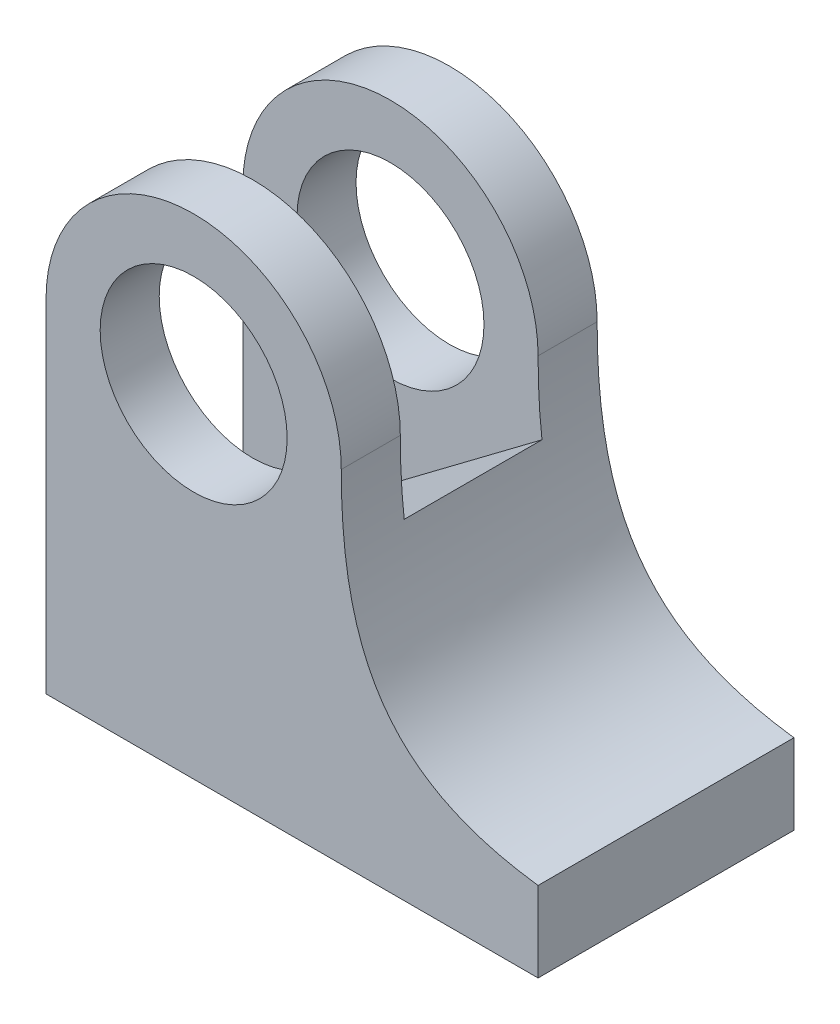
ISO-10303-21;
HEADER;
FILE_DESCRIPTION(('STEP AP214'),'2;1');
FILE_NAME('part.step','',(''),(''),'','','');
FILE_SCHEMA(('AUTOMOTIVE_DESIGN { 1 0 10303 214 1 1 1 1 }'));
ENDSEC;
DATA;
#1=APPLICATION_CONTEXT('core data for automotive mechanical design processes');
#2=APPLICATION_PROTOCOL_DEFINITION('international standard','automotive_design',2000,#1);
#3=PRODUCT_CONTEXT('',#1,'mechanical');
#4=PRODUCT('Part','Part','',(#3));
#5=PRODUCT_RELATED_PRODUCT_CATEGORY('part','',(#4));
#6=PRODUCT_DEFINITION_FORMATION('','',#4);
#7=PRODUCT_DEFINITION_CONTEXT('part definition',#1,'design');
#8=PRODUCT_DEFINITION('design','',#6,#7);
#9=PRODUCT_DEFINITION_SHAPE('','',#8);
#10=(LENGTH_UNIT() NAMED_UNIT(*) SI_UNIT(.MILLI.,.METRE.));
#11=(NAMED_UNIT(*) PLANE_ANGLE_UNIT() SI_UNIT($,.RADIAN.));
#12=(NAMED_UNIT(*) SI_UNIT($,.STERADIAN.) SOLID_ANGLE_UNIT());
#13=UNCERTAINTY_MEASURE_WITH_UNIT(LENGTH_MEASURE(1.E-05),#10,'distance_accuracy_value','');
#14=(GEOMETRIC_REPRESENTATION_CONTEXT(3) GLOBAL_UNCERTAINTY_ASSIGNED_CONTEXT((#13)) GLOBAL_UNIT_ASSIGNED_CONTEXT((#10,
#11,#12)) REPRESENTATION_CONTEXT('',''));
#15=CARTESIAN_POINT('',(0.,0.,0.));
#16=DIRECTION('',(0.,0.,1.));
#17=DIRECTION('',(1.,0.,0.));
#18=AXIS2_PLACEMENT_3D('',#15,#16,#17);
#19=CARTESIAN_POINT('',(0.,0.,26.));
#20=DIRECTION('',(0.,0.,-1.));
#21=DIRECTION('',(-1.,0.,0.));
#22=AXIS2_PLACEMENT_3D('',#19,#20,#21);
#23=CYLINDRICAL_SURFACE('',#22,15.);
#24=DIRECTION('',(0.,0.,-1.));
#25=VECTOR('',#24,1.);
#26=CARTESIAN_POINT('',(15.,0.,26.));
#27=LINE('',#26,#25);
#28=CARTESIAN_POINT('',(15.,0.,26.));
#29=VERTEX_POINT('',#28);
#30=CARTESIAN_POINT('',(15.,0.,20.0000000000003));
#31=VERTEX_POINT('',#30);
#32=EDGE_CURVE('E177',#29,#31,#27,.T.);
#33=ORIENTED_EDGE('',*,*,#32,.T.);
#34=CARTESIAN_POINT('',(0.,0.,20.));
#35=DIRECTION('',(0.,0.,1.));
#36=DIRECTION('',(1.,0.,0.));
#37=AXIS2_PLACEMENT_3D('',#34,#35,#36);
#38=CIRCLE('',#37,15.);
#39=CARTESIAN_POINT('',(-15.,0.,20.0000000000001));
#40=VERTEX_POINT('',#39);
#41=EDGE_CURVE('E180',#31,#40,#38,.T.);
#42=ORIENTED_EDGE('',*,*,#41,.T.);
#43=DIRECTION('',(0.,0.,-1.));
#44=VECTOR('',#43,1.);
#45=CARTESIAN_POINT('',(-15.,0.,26.));
#46=LINE('',#45,#44);
#47=CARTESIAN_POINT('',(-15.,0.,26.));
#48=VERTEX_POINT('',#47);
#49=EDGE_CURVE('E54',#48,#40,#46,.T.);
#50=ORIENTED_EDGE('',*,*,#49,.F.);
#51=CARTESIAN_POINT('',(0.,0.,26.));
#52=DIRECTION('',(0.,0.,1.));
#53=DIRECTION('',(1.,0.,0.));
#54=AXIS2_PLACEMENT_3D('',#51,#52,#53);
#55=CIRCLE('',#54,15.);
#56=EDGE_CURVE('E181',#29,#48,#55,.T.);
#57=ORIENTED_EDGE('',*,*,#56,.F.);
#58=EDGE_LOOP('',(#33,#42,#50,#57));
#59=FACE_BOUND('',#58,.T.);
#60=ADVANCED_FACE('F45',(#59),#23,.T.);
#61=CARTESIAN_POINT('',(0.,0.,26.));
#62=DIRECTION('',(0.,0.,-1.));
#63=DIRECTION('',(-1.,0.,0.));
#64=AXIS2_PLACEMENT_3D('',#61,#62,#63);
#65=CYLINDRICAL_SURFACE('',#64,9.5);
#66=CARTESIAN_POINT('',(0.,0.,20.));
#67=DIRECTION('',(0.,0.,1.));
#68=DIRECTION('',(1.,0.,0.));
#69=AXIS2_PLACEMENT_3D('',#66,#67,#68);
#70=CIRCLE('',#69,9.5);
#71=CARTESIAN_POINT('',(-9.5,0.,20.0000000000001));
#72=VERTEX_POINT('',#71);
#73=EDGE_CURVE('E205',#72,#72,#70,.T.);
#74=CARTESIAN_POINT('',(0.,0.,26.));
#75=DIRECTION('',(0.,0.,1.));
#76=DIRECTION('',(1.,0.,0.));
#77=AXIS2_PLACEMENT_3D('',#74,#75,#76);
#78=CIRCLE('',#77,9.5);
#79=CARTESIAN_POINT('',(-9.5,0.,26.));
#80=VERTEX_POINT('',#79);
#81=EDGE_CURVE('E241',#80,#80,#78,.T.);
#82=CARTESIAN_POINT('',(-9.5,0.,20.0000000000001));
#83=CARTESIAN_POINT('',(-9.5,0.,20.0625000000001));
#84=CARTESIAN_POINT('',(-9.5,0.,20.1250000000001));
#85=CARTESIAN_POINT('',(-9.5,0.,20.2500000000001));
#86=CARTESIAN_POINT('',(-9.5,0.,20.3125000000001));
#87=CARTESIAN_POINT('',(-9.5,0.,20.4375000000001));
#88=CARTESIAN_POINT('',(-9.5,0.,20.5000000000001));
#89=CARTESIAN_POINT('',(-9.5,0.,20.6250000000001));
#90=CARTESIAN_POINT('',(-9.5,0.,20.6875000000001));
#91=CARTESIAN_POINT('',(-9.5,0.,20.8125000000001));
#92=CARTESIAN_POINT('',(-9.5,0.,20.8750000000001));
#93=CARTESIAN_POINT('',(-9.5,0.,21.0000000000001));
#94=CARTESIAN_POINT('',(-9.5,0.,21.0625000000001));
#95=CARTESIAN_POINT('',(-9.5,0.,21.1875000000001));
#96=CARTESIAN_POINT('',(-9.5,0.,21.2500000000001));
#97=CARTESIAN_POINT('',(-9.5,0.,21.3750000000001));
#98=CARTESIAN_POINT('',(-9.5,0.,21.4375000000001));
#99=CARTESIAN_POINT('',(-9.5,0.,21.5625000000001));
#100=CARTESIAN_POINT('',(-9.5,0.,21.6250000000001));
#101=CARTESIAN_POINT('',(-9.5,0.,21.7500000000001));
#102=CARTESIAN_POINT('',(-9.5,0.,21.8125000000001));
#103=CARTESIAN_POINT('',(-9.5,0.,21.9375000000001));
#104=CARTESIAN_POINT('',(-9.5,0.,22.0000000000001));
#105=CARTESIAN_POINT('',(-9.5,0.,22.1250000000001));
#106=CARTESIAN_POINT('',(-9.5,0.,22.1875000000001));
#107=CARTESIAN_POINT('',(-9.5,0.,22.3125000000001));
#108=CARTESIAN_POINT('',(-9.5,0.,22.3750000000001));
#109=CARTESIAN_POINT('',(-9.5,0.,22.5000000000001));
#110=CARTESIAN_POINT('',(-9.5,0.,22.5625000000001));
#111=CARTESIAN_POINT('',(-9.5,0.,22.6875000000001));
#112=CARTESIAN_POINT('',(-9.5,0.,22.75));
#113=CARTESIAN_POINT('',(-9.5,0.,22.8750000000001));
#114=CARTESIAN_POINT('',(-9.5,0.,22.9375));
#115=CARTESIAN_POINT('',(-9.5,0.,23.0625));
#116=CARTESIAN_POINT('',(-9.5,0.,23.125));
#117=CARTESIAN_POINT('',(-9.5,0.,23.25));
#118=CARTESIAN_POINT('',(-9.5,0.,23.3125));
#119=CARTESIAN_POINT('',(-9.5,0.,23.4375));
#120=CARTESIAN_POINT('',(-9.5,0.,23.5));
#121=CARTESIAN_POINT('',(-9.5,0.,23.625));
#122=CARTESIAN_POINT('',(-9.5,0.,23.6875));
#123=CARTESIAN_POINT('',(-9.5,0.,23.8125));
#124=CARTESIAN_POINT('',(-9.5,0.,23.875));
#125=CARTESIAN_POINT('',(-9.5,0.,24.));
#126=CARTESIAN_POINT('',(-9.5,0.,24.0625));
#127=CARTESIAN_POINT('',(-9.5,0.,24.1875));
#128=CARTESIAN_POINT('',(-9.5,0.,24.25));
#129=CARTESIAN_POINT('',(-9.5,0.,24.375));
#130=CARTESIAN_POINT('',(-9.5,0.,24.4375));
#131=CARTESIAN_POINT('',(-9.5,0.,24.5625));
#132=CARTESIAN_POINT('',(-9.5,0.,24.625));
#133=CARTESIAN_POINT('',(-9.5,0.,24.75));
#134=CARTESIAN_POINT('',(-9.5,0.,24.8125));
#135=CARTESIAN_POINT('',(-9.5,0.,24.9375));
#136=CARTESIAN_POINT('',(-9.5,0.,25.));
#137=CARTESIAN_POINT('',(-9.5,0.,25.125));
#138=CARTESIAN_POINT('',(-9.5,0.,25.1875));
#139=CARTESIAN_POINT('',(-9.5,0.,25.3125));
#140=CARTESIAN_POINT('',(-9.5,0.,25.375));
#141=CARTESIAN_POINT('',(-9.5,0.,25.5));
#142=CARTESIAN_POINT('',(-9.5,0.,25.5625));
#143=CARTESIAN_POINT('',(-9.5,0.,25.6875));
#144=CARTESIAN_POINT('',(-9.5,0.,25.75));
#145=CARTESIAN_POINT('',(-9.5,0.,25.875));
#146=CARTESIAN_POINT('',(-9.5,0.,25.9375));
#147=CARTESIAN_POINT('',(-9.5,0.,26.));
#148=B_SPLINE_CURVE_WITH_KNOTS('',3,(#82,#83,#84,#85,#86,#87,#88,#89,#90,#91,#92,#93,#94,#95,
#96,#97,#98,#99,#100,#101,#102,#103,#104,#105,#106,#107,#108,#109,#110,#111,#112,#113,#114,#115,
#116,#117,#118,#119,#120,#121,#122,#123,#124,#125,#126,#127,#128,#129,#130,#131,#132,#133,#134,
#135,#136,#137,#138,#139,#140,#141,#142,#143,#144,#145,#146,#147),.UNSPECIFIED.,.F.,.F.,(4,2,2,
2,2,2,2,2,2,2,2,2,2,2,2,2,2,2,2,2,2,2,2,2,2,2,2,2,2,2,2,2,4),(0.,0.187499999999997,
0.374999999999993,0.56249999999999,0.74999999999999,0.937499999999983,1.12499999999998,
1.31249999999998,1.49999999999998,1.68749999999997,1.87499999999997,2.06249999999997,
2.24999999999996,2.43749999999996,2.62499999999996,2.81249999999995,2.99999999999995,
3.18749999999995,3.37499999999994,3.56249999999994,3.74999999999994,3.93749999999993,
4.12499999999993,4.31249999999993,4.49999999999992,4.68749999999992,4.87499999999992,
5.06249999999991,5.24999999999991,5.43749999999991,5.62499999999991,5.8124999999999,
5.9999999999999),.UNSPECIFIED.);
#149=EDGE_CURVE('BSEAM166',#72,#80,#148,.T.);
#150=ORIENTED_EDGE('',*,*,#73,.F.);
#151=ORIENTED_EDGE('',*,*,#81,.T.);
#152=ORIENTED_EDGE('',*,*,#149,.T.);
#153=ORIENTED_EDGE('',*,*,#149,.F.);
#154=EDGE_LOOP('',(#150,#152,#151,#153));
#155=FACE_BOUND('',#154,.T.);
#156=ADVANCED_FACE('F166',(#155),#65,.F.);
#157=CARTESIAN_POINT('',(0.,0.,26.));
#158=DIRECTION('',(0.,0.,1.));
#159=DIRECTION('',(1.,0.,0.));
#160=AXIS2_PLACEMENT_3D('',#157,#158,#159);
#161=PLANE('',#160);
#162=ORIENTED_EDGE('',*,*,#56,.T.);
#163=DIRECTION('',(0.,-1.,0.));
#164=VECTOR('',#163,1.);
#165=CARTESIAN_POINT('',(-15.,0.,26.));
#166=LINE('',#165,#164);
#167=CARTESIAN_POINT('',(-15.,-34.7537820322793,26.));
#168=VERTEX_POINT('',#167);
#169=EDGE_CURVE('E104',#48,#168,#166,.T.);
#170=ORIENTED_EDGE('',*,*,#169,.T.);
#171=DIRECTION('',(1.,0.,0.));
#172=VECTOR('',#171,1.);
#173=CARTESIAN_POINT('',(-15.,-34.7537820322793,26.));
#174=LINE('',#173,#172);
#175=CARTESIAN_POINT('',(35.,-34.7537820322793,26.));
#176=VERTEX_POINT('',#175);
#177=EDGE_CURVE('E110',#168,#176,#174,.T.);
#178=ORIENTED_EDGE('',*,*,#177,.T.);
#179=DIRECTION('',(0.,1.,0.));
#180=VECTOR('',#179,1.);
#181=CARTESIAN_POINT('',(35.,-34.7537820322793,26.));
#182=LINE('',#181,#180);
#183=CARTESIAN_POINT('',(35.,-26.607408272313,26.));
#184=VERTEX_POINT('',#183);
#185=EDGE_CURVE('E115',#176,#184,#182,.T.);
#186=ORIENTED_EDGE('',*,*,#185,.T.);
#187=CARTESIAN_POINT('',(35.,-26.607408272313,26.));
#188=CARTESIAN_POINT('',(19.6217819704293,-24.621800080863,26.));
#189=CARTESIAN_POINT('',(15.,-15.8296162884274,26.));
#190=CARTESIAN_POINT('',(15.,0.,26.));
#191=B_SPLINE_CURVE_WITH_KNOTS('',3,(#187,#188,#189,#190),.UNSPECIFIED.,.F.,.F.,(4,4),(0.,1.),.UNSPECIFIED.);
#192=EDGE_CURVE('E70',#184,#29,#191,.T.);
#193=ORIENTED_EDGE('',*,*,#192,.T.);
#194=EDGE_LOOP('',(#162,#170,#178,#186,#193));
#195=FACE_BOUND('',#194,.T.);
#196=ORIENTED_EDGE('',*,*,#81,.F.);
#197=EDGE_LOOP('',(#196));
#198=FACE_BOUND('',#197,.T.);
#199=ADVANCED_FACE('F112',(#195,#198),#161,.T.);
#200=CARTESIAN_POINT('',(0.,0.,0.));
#201=DIRECTION('',(0.,0.,1.));
#202=DIRECTION('',(1.,0.,0.));
#203=AXIS2_PLACEMENT_3D('',#200,#201,#202);
#204=PLANE('',#203);
#205=CARTESIAN_POINT('',(0.,0.,0.));
#206=DIRECTION('',(0.,0.,1.));
#207=DIRECTION('',(1.,0.,0.));
#208=AXIS2_PLACEMENT_3D('',#205,#206,#207);
#209=CIRCLE('',#208,15.);
#210=CARTESIAN_POINT('',(15.,0.,0.));
#211=VERTEX_POINT('',#210);
#212=CARTESIAN_POINT('',(-15.,0.,0.));
#213=VERTEX_POINT('',#212);
#214=EDGE_CURVE('E143',#211,#213,#209,.T.);
#215=ORIENTED_EDGE('',*,*,#214,.F.);
#216=CARTESIAN_POINT('',(35.,-26.607408272313,0.));
#217=CARTESIAN_POINT('',(19.6217819704293,-24.621800080863,0.));
#218=CARTESIAN_POINT('',(15.,-15.8296162884274,0.));
#219=CARTESIAN_POINT('',(15.,0.,0.));
#220=B_SPLINE_CURVE_WITH_KNOTS('',3,(#216,#217,#218,#219),.UNSPECIFIED.,.F.,.F.,(4,4),(0.,1.),.UNSPECIFIED.);
#221=CARTESIAN_POINT('',(35.,-26.607408272313,0.));
#222=VERTEX_POINT('',#221);
#223=EDGE_CURVE('E190',#222,#211,#220,.T.);
#224=ORIENTED_EDGE('',*,*,#223,.F.);
#225=DIRECTION('',(0.,1.,0.));
#226=VECTOR('',#225,1.);
#227=CARTESIAN_POINT('',(35.,-34.7537820322793,0.));
#228=LINE('',#227,#226);
#229=CARTESIAN_POINT('',(35.,-34.7537820322793,0.));
#230=VERTEX_POINT('',#229);
#231=EDGE_CURVE('E252',#230,#222,#228,.T.);
#232=ORIENTED_EDGE('',*,*,#231,.F.);
#233=DIRECTION('',(1.,0.,0.));
#234=VECTOR('',#233,1.);
#235=CARTESIAN_POINT('',(-15.,-34.7537820322793,0.));
#236=LINE('',#235,#234);
#237=CARTESIAN_POINT('',(-15.,-34.7537820322793,0.));
#238=VERTEX_POINT('',#237);
#239=EDGE_CURVE('E125',#238,#230,#236,.T.);
#240=ORIENTED_EDGE('',*,*,#239,.F.);
#241=DIRECTION('',(0.,-1.,0.));
#242=VECTOR('',#241,1.);
#243=CARTESIAN_POINT('',(-15.,0.,0.));
#244=LINE('',#243,#242);
#245=EDGE_CURVE('E255',#213,#238,#244,.T.);
#246=ORIENTED_EDGE('',*,*,#245,.F.);
#247=EDGE_LOOP('',(#215,#224,#232,#240,#246));
#248=FACE_BOUND('',#247,.T.);
#249=CARTESIAN_POINT('',(0.,0.,0.));
#250=DIRECTION('',(0.,0.,1.));
#251=DIRECTION('',(1.,0.,0.));
#252=AXIS2_PLACEMENT_3D('',#249,#250,#251);
#253=CIRCLE('',#252,9.5);
#254=CARTESIAN_POINT('',(-9.5,0.,0.));
#255=VERTEX_POINT('',#254);
#256=EDGE_CURVE('E240',#255,#255,#253,.T.);
#257=ORIENTED_EDGE('',*,*,#256,.T.);
#258=EDGE_LOOP('',(#257));
#259=FACE_BOUND('',#258,.T.);
#260=ADVANCED_FACE('F155',(#248,#259),#204,.F.);
#261=CARTESIAN_POINT('',(0.,0.,6.00000000000001));
#262=DIRECTION('',(0.,0.,-1.));
#263=DIRECTION('',(-1.,0.,0.));
#264=AXIS2_PLACEMENT_3D('',#261,#262,#263);
#265=CIRCLE('',#264,15.);
#266=CARTESIAN_POINT('',(-15.,0.,6.0000000000001));
#267=VERTEX_POINT('',#266);
#268=CARTESIAN_POINT('',(15.,0.,6.00000000000026));
#269=VERTEX_POINT('',#268);
#270=EDGE_CURVE('E216',#267,#269,#265,.T.);
#271=ORIENTED_EDGE('',*,*,#270,.T.);
#272=EDGE_CURVE('E95',#269,#211,#27,.T.);
#273=ORIENTED_EDGE('',*,*,#272,.T.);
#274=ORIENTED_EDGE('',*,*,#214,.T.);
#275=EDGE_CURVE('E197',#267,#213,#46,.T.);
#276=ORIENTED_EDGE('',*,*,#275,.F.);
#277=EDGE_LOOP('',(#271,#273,#274,#276));
#278=FACE_BOUND('',#277,.T.);
#279=ADVANCED_FACE('F47',(#278),#23,.T.);
#280=CARTESIAN_POINT('',(-15.,0.,26.));
#281=DIRECTION('',(1.,0.,0.));
#282=DIRECTION('',(0.,0.,-1.));
#283=AXIS2_PLACEMENT_3D('',#280,#281,#282);
#284=PLANE('',#283);
#285=ORIENTED_EDGE('',*,*,#49,.T.);
#286=DIRECTION('',(0.,-1.,0.));
#287=VECTOR('',#286,1.);
#288=CARTESIAN_POINT('',(-15.,0.,20.0000000000001));
#289=LINE('',#288,#287);
#290=CARTESIAN_POINT('',(-15.,-30.0400992057779,20.0000000000003));
#291=VERTEX_POINT('',#290);
#292=EDGE_CURVE('E233',#40,#291,#289,.T.);
#293=ORIENTED_EDGE('',*,*,#292,.T.);
#294=DIRECTION('',(0.,0.,-1.));
#295=VECTOR('',#294,1.);
#296=CARTESIAN_POINT('',(-15.,-30.0400992057779,26.));
#297=LINE('',#296,#295);
#298=CARTESIAN_POINT('',(-15.,-30.0400992057779,6.00000000000022));
#299=VERTEX_POINT('',#298);
#300=EDGE_CURVE('E237',#291,#299,#297,.T.);
#301=ORIENTED_EDGE('',*,*,#300,.T.);
#302=DIRECTION('',(0.,1.,0.));
#303=VECTOR('',#302,1.);
#304=CARTESIAN_POINT('',(-15.,0.,6.0000000000001));
#305=LINE('',#304,#303);
#306=EDGE_CURVE('E209',#299,#267,#305,.T.);
#307=ORIENTED_EDGE('',*,*,#306,.T.);
#308=ORIENTED_EDGE('',*,*,#275,.T.);
#309=ORIENTED_EDGE('',*,*,#245,.T.);
#310=DIRECTION('',(0.,0.,-1.));
#311=VECTOR('',#310,1.);
#312=CARTESIAN_POINT('',(-15.,-34.7537820322793,26.));
#313=LINE('',#312,#311);
#314=EDGE_CURVE('E129',#168,#238,#313,.T.);
#315=ORIENTED_EDGE('',*,*,#314,.F.);
#316=ORIENTED_EDGE('',*,*,#169,.F.);
#317=EDGE_LOOP('',(#285,#293,#301,#307,#308,#309,#315,#316));
#318=FACE_BOUND('',#317,.T.);
#319=ADVANCED_FACE('F160',(#318),#284,.F.);
#320=CARTESIAN_POINT('',(-15.,-34.7537820322793,26.));
#321=DIRECTION('',(0.,1.,0.));
#322=DIRECTION('',(0.,0.,1.));
#323=AXIS2_PLACEMENT_3D('',#320,#321,#322);
#324=PLANE('',#323);
#325=ORIENTED_EDGE('',*,*,#239,.T.);
#326=DIRECTION('',(0.,0.,-1.));
#327=VECTOR('',#326,1.);
#328=CARTESIAN_POINT('',(35.,-34.7537820322793,26.));
#329=LINE('',#328,#327);
#330=EDGE_CURVE('E122',#176,#230,#329,.T.);
#331=ORIENTED_EDGE('',*,*,#330,.F.);
#332=ORIENTED_EDGE('',*,*,#177,.F.);
#333=ORIENTED_EDGE('',*,*,#314,.T.);
#334=EDGE_LOOP('',(#325,#331,#332,#333));
#335=FACE_BOUND('',#334,.T.);
#336=ADVANCED_FACE('F123',(#335),#324,.F.);
#337=CARTESIAN_POINT('',(35.,-34.7537820322793,26.));
#338=DIRECTION('',(-1.,0.,0.));
#339=DIRECTION('',(0.,0.,1.));
#340=AXIS2_PLACEMENT_3D('',#337,#338,#339);
#341=PLANE('',#340);
#342=ORIENTED_EDGE('',*,*,#231,.T.);
#343=DIRECTION('',(0.,0.,-1.));
#344=VECTOR('',#343,1.);
#345=CARTESIAN_POINT('',(35.,-26.607408272313,26.));
#346=LINE('',#345,#344);
#347=EDGE_CURVE('E130',#184,#222,#346,.T.);
#348=ORIENTED_EDGE('',*,*,#347,.F.);
#349=ORIENTED_EDGE('',*,*,#185,.F.);
#350=ORIENTED_EDGE('',*,*,#330,.T.);
#351=EDGE_LOOP('',(#342,#348,#349,#350));
#352=FACE_BOUND('',#351,.T.);
#353=ADVANCED_FACE('F132',(#352),#341,.F.);
#354=DIRECTION('',(0.,0.,-1.));
#355=VECTOR('',#354,1.);
#356=SURFACE_OF_LINEAR_EXTRUSION('',#191,#355);
#357=DIRECTION('',(0.,0.,-1.));
#358=VECTOR('',#357,1.);
#359=CARTESIAN_POINT('',(15.3963523943599,-7.1920622355709,26.));
#360=LINE('',#359,#358);
#361=CARTESIAN_POINT('',(15.3963523943599,-7.1920622355709,5.99999999999995));
#362=VERTEX_POINT('',#361);
#363=CARTESIAN_POINT('',(15.3963523943599,-7.1920622355709,20.0000000000001));
#364=VERTEX_POINT('',#363);
#365=EDGE_CURVE('E11',#362,#364,#360,.F.);
#366=ORIENTED_EDGE('',*,*,#365,.T.);
#367=CARTESIAN_POINT('',(35.,-26.607408272313,20.0000000000003));
#368=CARTESIAN_POINT('',(19.6217819704293,-24.621800080863,20.0000000000003));
#369=CARTESIAN_POINT('',(15.,-15.8296162884274,20.0000000000003));
#370=CARTESIAN_POINT('',(15.,0.,20.0000000000003));
#371=B_SPLINE_CURVE_WITH_KNOTS('',3,(#367,#368,#369,#370),.UNSPECIFIED.,.F.,.F.,(4,4),(0.,1.),.UNSPECIFIED.);
#372=EDGE_CURVE('E208',#364,#31,#371,.T.);
#373=ORIENTED_EDGE('',*,*,#372,.T.);
#374=ORIENTED_EDGE('',*,*,#32,.F.);
#375=ORIENTED_EDGE('',*,*,#192,.F.);
#376=ORIENTED_EDGE('',*,*,#347,.T.);
#377=ORIENTED_EDGE('',*,*,#223,.T.);
#378=ORIENTED_EDGE('',*,*,#272,.F.);
#379=CARTESIAN_POINT('',(35.,-26.607408272313,6.00000000000026));
#380=CARTESIAN_POINT('',(19.6217819704293,-24.621800080863,6.00000000000026));
#381=CARTESIAN_POINT('',(15.,-15.8296162884274,6.00000000000026));
#382=CARTESIAN_POINT('',(15.,0.,6.00000000000026));
#383=B_SPLINE_CURVE_WITH_KNOTS('',3,(#379,#380,#381,#382),.UNSPECIFIED.,.F.,.F.,(4,4),(0.,1.),.UNSPECIFIED.);
#384=EDGE_CURVE('E203',#269,#362,#383,.F.);
#385=ORIENTED_EDGE('',*,*,#384,.T.);
#386=EDGE_LOOP('',(#366,#373,#374,#375,#376,#377,#378,#385));
#387=FACE_BOUND('',#386,.T.);
#388=ADVANCED_FACE('F149',(#387),#356,.F.);
#389=CARTESIAN_POINT('',(0.,0.,6.00000000000001));
#390=DIRECTION('',(0.,0.,-1.));
#391=DIRECTION('',(-1.,0.,0.));
#392=AXIS2_PLACEMENT_3D('',#389,#390,#391);
#393=CIRCLE('',#392,9.5);
#394=CARTESIAN_POINT('',(-9.5,0.,6.00000000000007));
#395=VERTEX_POINT('',#394);
#396=EDGE_CURVE('E200',#395,#395,#393,.T.);
#397=CARTESIAN_POINT('',(-9.5,0.,6.00000000000007));
#398=CARTESIAN_POINT('',(-9.5,0.,5.93750000000007));
#399=CARTESIAN_POINT('',(-9.5,0.,5.87500000000006));
#400=CARTESIAN_POINT('',(-9.5,0.,5.75000000000006));
#401=CARTESIAN_POINT('',(-9.5,0.,5.68750000000006));
#402=CARTESIAN_POINT('',(-9.5,0.,5.56250000000006));
#403=CARTESIAN_POINT('',(-9.5,0.,5.50000000000006));
#404=CARTESIAN_POINT('',(-9.5,0.,5.37500000000006));
#405=CARTESIAN_POINT('',(-9.5,0.,5.31250000000006));
#406=CARTESIAN_POINT('',(-9.5,0.,5.18750000000006));
#407=CARTESIAN_POINT('',(-9.5,0.,5.12500000000006));
#408=CARTESIAN_POINT('',(-9.5,0.,5.00000000000006));
#409=CARTESIAN_POINT('',(-9.5,0.,4.93750000000006));
#410=CARTESIAN_POINT('',(-9.5,0.,4.81250000000006));
#411=CARTESIAN_POINT('',(-9.5,0.,4.75000000000005));
#412=CARTESIAN_POINT('',(-9.5,0.,4.62500000000005));
#413=CARTESIAN_POINT('',(-9.5,0.,4.56250000000005));
#414=CARTESIAN_POINT('',(-9.5,0.,4.43750000000005));
#415=CARTESIAN_POINT('',(-9.5,0.,4.37500000000005));
#416=CARTESIAN_POINT('',(-9.5,0.,4.25000000000005));
#417=CARTESIAN_POINT('',(-9.5,0.,4.18750000000005));
#418=CARTESIAN_POINT('',(-9.5,0.,4.06250000000005));
#419=CARTESIAN_POINT('',(-9.5,0.,4.00000000000005));
#420=CARTESIAN_POINT('',(-9.5,0.,3.87500000000004));
#421=CARTESIAN_POINT('',(-9.5,0.,3.81250000000004));
#422=CARTESIAN_POINT('',(-9.5,0.,3.68750000000004));
#423=CARTESIAN_POINT('',(-9.5,0.,3.62500000000004));
#424=CARTESIAN_POINT('',(-9.5,0.,3.50000000000004));
#425=CARTESIAN_POINT('',(-9.5,0.,3.43750000000004));
#426=CARTESIAN_POINT('',(-9.5,0.,3.31250000000004));
#427=CARTESIAN_POINT('',(-9.5,0.,3.25000000000004));
#428=CARTESIAN_POINT('',(-9.5,0.,3.12500000000004));
#429=CARTESIAN_POINT('',(-9.5,0.,3.06250000000004));
#430=CARTESIAN_POINT('',(-9.5,0.,2.93750000000003));
#431=CARTESIAN_POINT('',(-9.5,0.,2.87500000000003));
#432=CARTESIAN_POINT('',(-9.5,0.,2.75000000000003));
#433=CARTESIAN_POINT('',(-9.5,0.,2.68750000000003));
#434=CARTESIAN_POINT('',(-9.5,0.,2.56250000000003));
#435=CARTESIAN_POINT('',(-9.5,0.,2.50000000000003));
#436=CARTESIAN_POINT('',(-9.5,0.,2.37500000000003));
#437=CARTESIAN_POINT('',(-9.5,0.,2.31250000000003));
#438=CARTESIAN_POINT('',(-9.5,0.,2.18750000000002));
#439=CARTESIAN_POINT('',(-9.5,0.,2.12500000000002));
#440=CARTESIAN_POINT('',(-9.5,0.,2.00000000000002));
#441=CARTESIAN_POINT('',(-9.5,0.,1.93750000000002));
#442=CARTESIAN_POINT('',(-9.5,0.,1.81250000000002));
#443=CARTESIAN_POINT('',(-9.5,0.,1.75000000000002));
#444=CARTESIAN_POINT('',(-9.5,0.,1.62500000000002));
#445=CARTESIAN_POINT('',(-9.5,0.,1.56250000000002));
#446=CARTESIAN_POINT('',(-9.5,0.,1.43750000000002));
#447=CARTESIAN_POINT('',(-9.5,0.,1.37500000000002));
#448=CARTESIAN_POINT('',(-9.5,0.,1.25000000000002));
#449=CARTESIAN_POINT('',(-9.5,0.,1.18750000000001));
#450=CARTESIAN_POINT('',(-9.5,0.,1.06250000000001));
#451=CARTESIAN_POINT('',(-9.5,0.,1.00000000000001));
#452=CARTESIAN_POINT('',(-9.5,0.,0.87500000000001));
#453=CARTESIAN_POINT('',(-9.5,0.,0.812500000000009));
#454=CARTESIAN_POINT('',(-9.5,0.,0.687500000000008));
#455=CARTESIAN_POINT('',(-9.5,0.,0.625000000000008));
#456=CARTESIAN_POINT('',(-9.5,0.,0.500000000000006));
#457=CARTESIAN_POINT('',(-9.5,0.,0.437500000000005));
#458=CARTESIAN_POINT('',(-9.5,0.,0.312500000000003));
#459=CARTESIAN_POINT('',(-9.5,0.,0.250000000000001));
#460=CARTESIAN_POINT('',(-9.5,0.,0.125));
#461=CARTESIAN_POINT('',(-9.5,0.,0.0625000000000001));
#462=CARTESIAN_POINT('',(-9.5,0.,0.));
#463=B_SPLINE_CURVE_WITH_KNOTS('',3,(#397,#398,#399,#400,#401,#402,#403,#404,#405,#406,#407,
#408,#409,#410,#411,#412,#413,#414,#415,#416,#417,#418,#419,#420,#421,#422,#423,#424,#425,#426,
#427,#428,#429,#430,#431,#432,#433,#434,#435,#436,#437,#438,#439,#440,#441,#442,#443,#444,#445,
#446,#447,#448,#449,#450,#451,#452,#453,#454,#455,#456,#457,#458,#459,#460,#461,#462),
.UNSPECIFIED.,.F.,.F.,(4,2,2,2,2,2,2,2,2,2,2,2,2,2,2,2,2,2,2,2,2,2,2,2,2,2,2,2,2,2,2,2,4),(0.,
0.187500000000004,0.375000000000004,0.562500000000007,0.750000000000008,0.937500000000011,
1.12500000000001,1.31250000000002,1.50000000000002,1.68750000000002,1.87500000000002,
2.06250000000002,2.25000000000003,2.43750000000003,2.62500000000003,2.81250000000003,
3.00000000000003,3.18750000000004,3.37500000000004,3.56250000000004,3.75000000000004,
3.93750000000005,4.12500000000005,4.31250000000005,4.50000000000005,4.68750000000005,
4.87500000000005,5.06250000000006,5.25000000000006,5.43750000000006,5.62500000000006,
5.81250000000007,6.00000000000007),.UNSPECIFIED.);
#464=EDGE_CURVE('BSEAM153',#395,#255,#463,.T.);
#465=ORIENTED_EDGE('',*,*,#396,.F.);
#466=ORIENTED_EDGE('',*,*,#256,.F.);
#467=ORIENTED_EDGE('',*,*,#464,.T.);
#468=ORIENTED_EDGE('',*,*,#464,.F.);
#469=EDGE_LOOP('',(#465,#467,#466,#468));
#470=FACE_BOUND('',#469,.T.);
#471=ADVANCED_FACE('F153',(#470),#65,.F.);
#472=CARTESIAN_POINT('',(-18.9724296904869,-33.026056838202,20.0000000000003));
#473=DIRECTION('',(0.600854193417809,-0.799358641819949,0.));
#474=DIRECTION('',(0.799358641819949,0.600854193417809,0.));
#475=AXIS2_PLACEMENT_3D('',#472,#473,#474);
#476=PLANE('',#475);
#477=DIRECTION('',(0.799358641819949,0.600854193417809,0.));
#478=VECTOR('',#477,1.);
#479=CARTESIAN_POINT('',(-18.9724296904869,-33.026056838202,20.0000000000003));
#480=LINE('',#479,#478);
#481=EDGE_CURVE('E61',#291,#364,#480,.T.);
#482=ORIENTED_EDGE('',*,*,#481,.T.);
#483=ORIENTED_EDGE('',*,*,#365,.F.);
#484=DIRECTION('',(0.799358641819949,0.600854193417809,0.));
#485=VECTOR('',#484,1.);
#486=CARTESIAN_POINT('',(-18.972429690487,-33.026056838202,6.00000000000025));
#487=LINE('',#486,#485);
#488=EDGE_CURVE('E204',#299,#362,#487,.T.);
#489=ORIENTED_EDGE('',*,*,#488,.F.);
#490=ORIENTED_EDGE('',*,*,#300,.F.);
#491=EDGE_LOOP('',(#482,#483,#489,#490));
#492=FACE_BOUND('',#491,.T.);
#493=ADVANCED_FACE('F276',(#492),#476,.F.);
#494=CARTESIAN_POINT('',(-36.9980554930212,-9.04529758360351,20.0000000000003));
#495=DIRECTION('',(0.,0.,1.));
#496=DIRECTION('',(1.,0.,0.));
#497=AXIS2_PLACEMENT_3D('',#494,#495,#496);
#498=PLANE('',#497);
#499=ORIENTED_EDGE('',*,*,#73,.T.);
#500=EDGE_LOOP('',(#499));
#501=FACE_BOUND('',#500,.T.);
#502=ORIENTED_EDGE('',*,*,#41,.F.);
#503=ORIENTED_EDGE('',*,*,#372,.F.);
#504=ORIENTED_EDGE('',*,*,#481,.F.);
#505=ORIENTED_EDGE('',*,*,#292,.F.);
#506=EDGE_LOOP('',(#502,#503,#504,#505));
#507=FACE_BOUND('',#506,.T.);
#508=ADVANCED_FACE('F280',(#501,#507),#498,.F.);
#509=CARTESIAN_POINT('',(-36.9980554930212,-9.04529758360356,6.00000000000025));
#510=DIRECTION('',(0.,0.,-1.));
#511=DIRECTION('',(-1.,0.,0.));
#512=AXIS2_PLACEMENT_3D('',#509,#510,#511);
#513=PLANE('',#512);
#514=ORIENTED_EDGE('',*,*,#396,.T.);
#515=EDGE_LOOP('',(#514));
#516=FACE_BOUND('',#515,.T.);
#517=ORIENTED_EDGE('',*,*,#488,.T.);
#518=ORIENTED_EDGE('',*,*,#384,.F.);
#519=ORIENTED_EDGE('',*,*,#270,.F.);
#520=ORIENTED_EDGE('',*,*,#306,.F.);
#521=EDGE_LOOP('',(#517,#518,#519,#520));
#522=FACE_BOUND('',#521,.T.);
#523=ADVANCED_FACE('F292',(#516,#522),#513,.F.);
#524=CLOSED_SHELL('',(#60,#156,#199,#260,#279,#319,#336,#353,#388,#471,#493,#508,#523));
#525=MANIFOLD_SOLID_BREP('B2',#524);
#526=ADVANCED_BREP_SHAPE_REPRESENTATION('',(#18,#525),#14);
#527=SHAPE_DEFINITION_REPRESENTATION(#9,#526);
ENDSEC;
END-ISO-10303-21;
